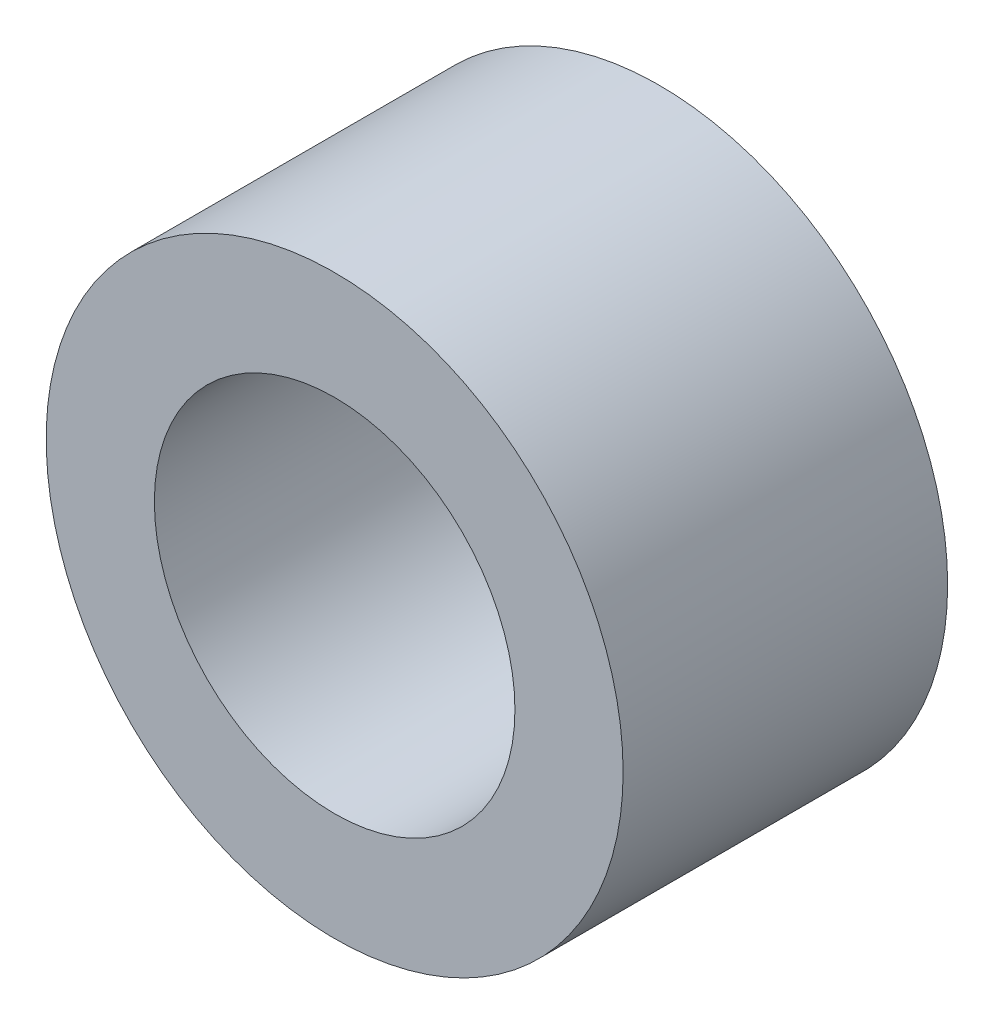
ISO-10303-21;
HEADER;
FILE_DESCRIPTION(('STEP AP214'),'2;1');
FILE_NAME('part.step','',(''),(''),'','','');
FILE_SCHEMA(('AUTOMOTIVE_DESIGN { 1 0 10303 214 1 1 1 1 }'));
ENDSEC;
DATA;
#1=APPLICATION_CONTEXT('core data for automotive mechanical design processes');
#2=APPLICATION_PROTOCOL_DEFINITION('international standard','automotive_design',2000,#1);
#3=PRODUCT_CONTEXT('',#1,'mechanical');
#4=PRODUCT('Part','Part','',(#3));
#5=PRODUCT_RELATED_PRODUCT_CATEGORY('part','',(#4));
#6=PRODUCT_DEFINITION_FORMATION('','',#4);
#7=PRODUCT_DEFINITION_CONTEXT('part definition',#1,'design');
#8=PRODUCT_DEFINITION('design','',#6,#7);
#9=PRODUCT_DEFINITION_SHAPE('','',#8);
#10=(LENGTH_UNIT() NAMED_UNIT(*) SI_UNIT(.MILLI.,.METRE.));
#11=(NAMED_UNIT(*) PLANE_ANGLE_UNIT() SI_UNIT($,.RADIAN.));
#12=(NAMED_UNIT(*) SI_UNIT($,.STERADIAN.) SOLID_ANGLE_UNIT());
#13=UNCERTAINTY_MEASURE_WITH_UNIT(LENGTH_MEASURE(1.E-05),#10,'distance_accuracy_value','');
#14=(GEOMETRIC_REPRESENTATION_CONTEXT(3) GLOBAL_UNCERTAINTY_ASSIGNED_CONTEXT((#13)) GLOBAL_UNIT_ASSIGNED_CONTEXT((#10,
#11,#12)) REPRESENTATION_CONTEXT('',''));
#15=CARTESIAN_POINT('',(0.,0.,0.));
#16=DIRECTION('',(0.,0.,1.));
#17=DIRECTION('',(1.,0.,0.));
#18=AXIS2_PLACEMENT_3D('',#15,#16,#17);
#19=CARTESIAN_POINT('',(0.,0.,4.5));
#20=DIRECTION('',(0.,0.,1.));
#21=DIRECTION('',(1.,0.,0.));
#22=AXIS2_PLACEMENT_3D('',#19,#20,#21);
#23=PLANE('',#22);
#24=CARTESIAN_POINT('',(0.,0.,4.5));
#25=DIRECTION('',(0.,0.,1.));
#26=DIRECTION('',(1.,0.,0.));
#27=AXIS2_PLACEMENT_3D('',#24,#25,#26);
#28=CIRCLE('',#27,4.);
#29=CARTESIAN_POINT('',(4.,0.,4.5));
#30=VERTEX_POINT('',#29);
#31=EDGE_CURVE('E10',#30,#30,#28,.T.);
#32=ORIENTED_EDGE('',*,*,#31,.T.);
#33=EDGE_LOOP('',(#32));
#34=FACE_BOUND('',#33,.T.);
#35=CARTESIAN_POINT('',(0.,0.,4.5));
#36=DIRECTION('',(0.,0.,1.));
#37=DIRECTION('',(1.,0.,0.));
#38=AXIS2_PLACEMENT_3D('',#35,#36,#37);
#39=CIRCLE('',#38,2.5);
#40=CARTESIAN_POINT('',(2.5,0.,4.5));
#41=VERTEX_POINT('',#40);
#42=EDGE_CURVE('E43',#41,#41,#39,.T.);
#43=ORIENTED_EDGE('',*,*,#42,.F.);
#44=EDGE_LOOP('',(#43));
#45=FACE_BOUND('',#44,.T.);
#46=ADVANCED_FACE('F32',(#34,#45),#23,.T.);
#47=CARTESIAN_POINT('',(0.,0.,0.));
#48=DIRECTION('',(0.,0.,1.));
#49=DIRECTION('',(1.,0.,0.));
#50=AXIS2_PLACEMENT_3D('',#47,#48,#49);
#51=PLANE('',#50);
#52=CARTESIAN_POINT('',(0.,0.,0.));
#53=DIRECTION('',(0.,0.,1.));
#54=DIRECTION('',(1.,0.,0.));
#55=AXIS2_PLACEMENT_3D('',#52,#53,#54);
#56=CIRCLE('',#55,4.);
#57=CARTESIAN_POINT('',(4.,0.,0.));
#58=VERTEX_POINT('',#57);
#59=EDGE_CURVE('E36',#58,#58,#56,.T.);
#60=ORIENTED_EDGE('',*,*,#59,.F.);
#61=EDGE_LOOP('',(#60));
#62=FACE_BOUND('',#61,.T.);
#63=CARTESIAN_POINT('',(0.,0.,0.));
#64=DIRECTION('',(0.,0.,1.));
#65=DIRECTION('',(1.,0.,0.));
#66=AXIS2_PLACEMENT_3D('',#63,#64,#65);
#67=CIRCLE('',#66,2.5);
#68=CARTESIAN_POINT('',(2.5,0.,0.));
#69=VERTEX_POINT('',#68);
#70=EDGE_CURVE('E45',#69,#69,#67,.T.);
#71=ORIENTED_EDGE('',*,*,#70,.T.);
#72=EDGE_LOOP('',(#71));
#73=FACE_BOUND('',#72,.T.);
#74=ADVANCED_FACE('F55',(#62,#73),#51,.F.);
#75=CARTESIAN_POINT('',(0.,0.,4.5));
#76=DIRECTION('',(0.,0.,-1.));
#77=DIRECTION('',(-1.,0.,0.));
#78=AXIS2_PLACEMENT_3D('',#75,#76,#77);
#79=CYLINDRICAL_SURFACE('',#78,4.);
#80=ORIENTED_EDGE('',*,*,#31,.F.);
#81=EDGE_LOOP('',(#80));
#82=FACE_BOUND('',#81,.T.);
#83=ORIENTED_EDGE('',*,*,#59,.T.);
#84=EDGE_LOOP('',(#83));
#85=FACE_BOUND('',#84,.T.);
#86=ADVANCED_FACE('F34',(#82,#85),#79,.T.);
#87=CARTESIAN_POINT('',(0.,0.,4.5));
#88=DIRECTION('',(0.,0.,-1.));
#89=DIRECTION('',(-1.,0.,0.));
#90=AXIS2_PLACEMENT_3D('',#87,#88,#89);
#91=CYLINDRICAL_SURFACE('',#90,2.5);
#92=ORIENTED_EDGE('',*,*,#42,.T.);
#93=EDGE_LOOP('',(#92));
#94=FACE_BOUND('',#93,.T.);
#95=ORIENTED_EDGE('',*,*,#70,.F.);
#96=EDGE_LOOP('',(#95));
#97=FACE_BOUND('',#96,.T.);
#98=ADVANCED_FACE('F51',(#94,#97),#91,.F.);
#99=CLOSED_SHELL('',(#46,#74,#86,#98));
#100=MANIFOLD_SOLID_BREP('B2',#99);
#101=ADVANCED_BREP_SHAPE_REPRESENTATION('',(#18,#100),#14);
#102=SHAPE_DEFINITION_REPRESENTATION(#9,#101);
ENDSEC;
END-ISO-10303-21;
